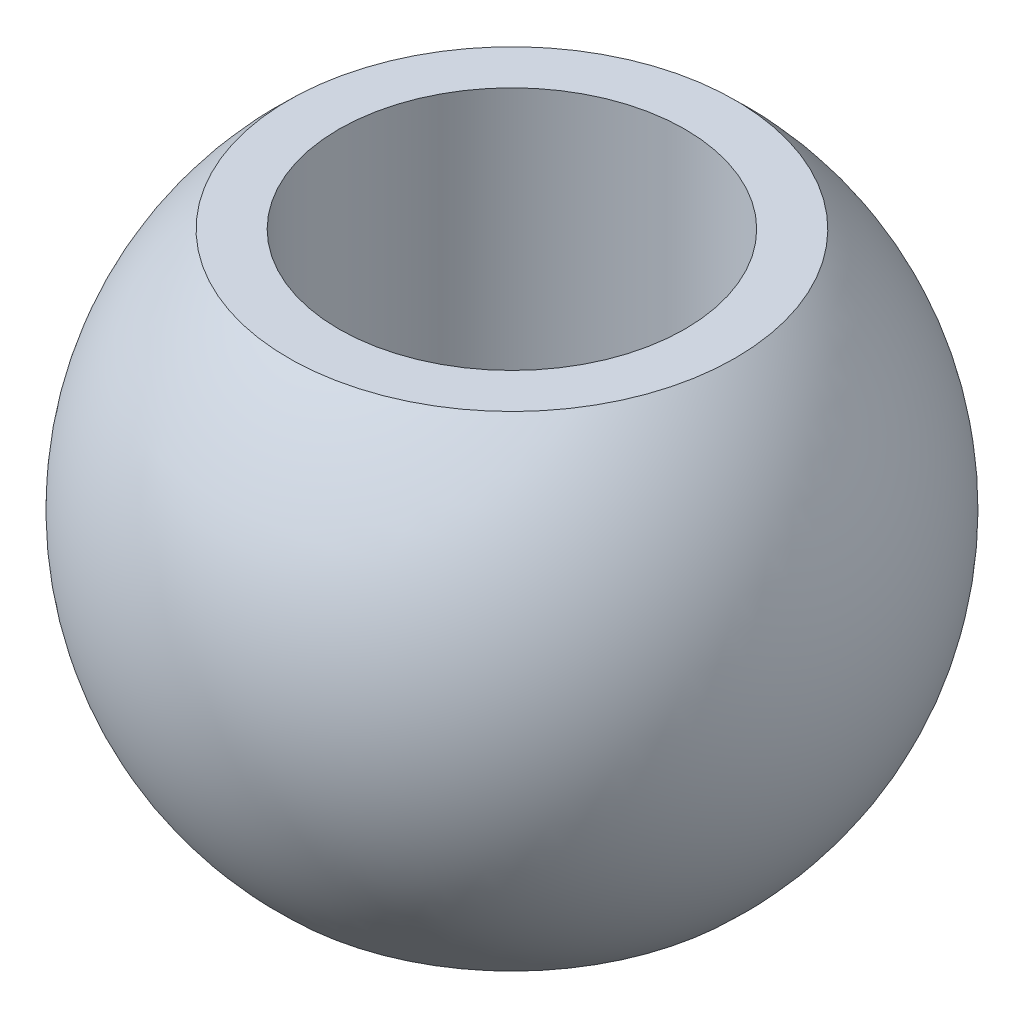
ISO-10303-21;
HEADER;
FILE_DESCRIPTION(('STEP AP214'),'2;1');
FILE_NAME('part.step','',(''),(''),'','','');
FILE_SCHEMA(('AUTOMOTIVE_DESIGN { 1 0 10303 214 1 1 1 1 }'));
ENDSEC;
DATA;
#1=APPLICATION_CONTEXT('core data for automotive mechanical design processes');
#2=APPLICATION_PROTOCOL_DEFINITION('international standard','automotive_design',2000,#1);
#3=PRODUCT_CONTEXT('',#1,'mechanical');
#4=PRODUCT('Part','Part','',(#3));
#5=PRODUCT_RELATED_PRODUCT_CATEGORY('part','',(#4));
#6=PRODUCT_DEFINITION_FORMATION('','',#4);
#7=PRODUCT_DEFINITION_CONTEXT('part definition',#1,'design');
#8=PRODUCT_DEFINITION('design','',#6,#7);
#9=PRODUCT_DEFINITION_SHAPE('','',#8);
#10=(LENGTH_UNIT() NAMED_UNIT(*) SI_UNIT(.MILLI.,.METRE.));
#11=(NAMED_UNIT(*) PLANE_ANGLE_UNIT() SI_UNIT($,.RADIAN.));
#12=(NAMED_UNIT(*) SI_UNIT($,.STERADIAN.) SOLID_ANGLE_UNIT());
#13=UNCERTAINTY_MEASURE_WITH_UNIT(LENGTH_MEASURE(1.E-05),#10,'distance_accuracy_value','');
#14=(GEOMETRIC_REPRESENTATION_CONTEXT(3) GLOBAL_UNCERTAINTY_ASSIGNED_CONTEXT((#13)) GLOBAL_UNIT_ASSIGNED_CONTEXT((#10,
#11,#12)) REPRESENTATION_CONTEXT('',''));
#15=CARTESIAN_POINT('',(0.,0.,0.));
#16=DIRECTION('',(0.,0.,1.));
#17=DIRECTION('',(1.,0.,0.));
#18=AXIS2_PLACEMENT_3D('',#15,#16,#17);
#19=CARTESIAN_POINT('',(5.,-7.,0.));
#20=DIRECTION('',(0.,-1.,0.));
#21=DIRECTION('',(0.,0.,-1.));
#22=AXIS2_PLACEMENT_3D('',#19,#20,#21);
#23=PLANE('',#22);
#24=CARTESIAN_POINT('',(0.,-7.,0.));
#25=DIRECTION('',(0.,-1.,0.));
#26=DIRECTION('',(0.,0.,-1.));
#27=AXIS2_PLACEMENT_3D('',#24,#25,#26);
#28=CIRCLE('',#27,6.45216242820963);
#29=CARTESIAN_POINT('',(6.45216242820963,-7.,0.));
#30=VERTEX_POINT('',#29);
#31=EDGE_CURVE('E10',#30,#30,#28,.T.);
#32=ORIENTED_EDGE('',*,*,#31,.T.);
#33=EDGE_LOOP('',(#32));
#34=FACE_BOUND('',#33,.T.);
#35=CARTESIAN_POINT('',(0.,-7.,0.));
#36=DIRECTION('',(0.,-1.,0.));
#37=DIRECTION('',(0.,0.,-1.));
#38=AXIS2_PLACEMENT_3D('',#35,#36,#37);
#39=CIRCLE('',#38,5.);
#40=CARTESIAN_POINT('',(0.,-7.,-5.));
#41=VERTEX_POINT('',#40);
#42=EDGE_CURVE('E45',#41,#41,#39,.T.);
#43=ORIENTED_EDGE('',*,*,#42,.F.);
#44=EDGE_LOOP('',(#43));
#45=FACE_BOUND('',#44,.T.);
#46=ADVANCED_FACE('F31',(#34,#45),#23,.T.);
#47=CARTESIAN_POINT('',(0.,0.,0.));
#48=DIRECTION('',(0.,-1.,0.));
#49=DIRECTION('',(1.,0.,0.));
#50=AXIS2_PLACEMENT_3D('',#47,#48,#49);
#51=SPHERICAL_SURFACE('',#50,9.52);
#52=CARTESIAN_POINT('',(0.,7.,0.));
#53=DIRECTION('',(0.,-1.,0.));
#54=DIRECTION('',(0.,0.,-1.));
#55=AXIS2_PLACEMENT_3D('',#52,#53,#54);
#56=CIRCLE('',#55,6.45216242820963);
#57=CARTESIAN_POINT('',(6.45216242820963,7.,0.));
#58=VERTEX_POINT('',#57);
#59=EDGE_CURVE('E37',#58,#58,#56,.T.);
#60=CARTESIAN_POINT('',(6.45216242820963,7.,0.));
#61=CARTESIAN_POINT('',(6.57263831351205,6.88895835952866,0.));
#62=CARTESIAN_POINT('',(6.69024186429578,6.77480103558679,0.));
#63=CARTESIAN_POINT('',(6.9194035674325,6.54057170507044,0.));
#64=CARTESIAN_POINT('',(7.03096171978549,6.42049969849596,0.));
#65=CARTESIAN_POINT('',(7.24773189666743,6.17475768702286,0.));
#66=CARTESIAN_POINT('',(7.35294392119637,6.04908768212425,0.));
#67=CARTESIAN_POINT('',(7.55674234396531,5.79248550197799,0.));
#68=CARTESIAN_POINT('',(7.65532874220531,5.66155332673034,0.));
#69=CARTESIAN_POINT('',(7.84561291573048,5.39477552679382,0.));
#70=CARTESIAN_POINT('',(7.93731069101564,5.25892990210494,0.));
#71=CARTESIAN_POINT('',(8.11357329146901,4.98268732276817,0.));
#72=CARTESIAN_POINT('',(8.1981381166372,4.84229036812027,0.));
#73=CARTESIAN_POINT('',(8.35990941735937,4.55731929728127,0.));
#74=CARTESIAN_POINT('',(8.43711589291333,4.41274518109016,0.));
#75=CARTESIAN_POINT('',(8.58396472861792,4.11980511031353,0.));
#76=CARTESIAN_POINT('',(8.65360708876854,3.97143915572801,0.));
#77=CARTESIAN_POINT('',(8.78514208177438,3.67131083147481,0.));
#78=CARTESIAN_POINT('',(8.8470347146296,3.51954846180712,0.));
#79=CARTESIAN_POINT('',(8.96290529730284,3.21303178438142,0.));
#80=CARTESIAN_POINT('',(9.01688324712085,3.05827747662342,0.));
#81=CARTESIAN_POINT('',(9.11678060174181,2.7461893736955,0.));
#82=CARTESIAN_POINT('',(9.16270000654474,2.58885557852558,0.));
#83=CARTESIAN_POINT('',(9.24635788688498,2.27202782640738,0.));
#84=CARTESIAN_POINT('',(9.28409636242228,2.11253386945911,0.));
#85=CARTESIAN_POINT('',(9.35129180374073,1.79181087664509,0.));
#86=CARTESIAN_POINT('',(9.38074876952189,1.63058184077935,0.));
#87=CARTESIAN_POINT('',(9.43130268270342,1.30681839732704,0.));
#88=CARTESIAN_POINT('',(9.4523996301038,1.14428398974046,0.));
#89=CARTESIAN_POINT('',(9.48617727899556,0.818342989114177,0.));
#90=CARTESIAN_POINT('',(9.49885798048695,0.654936396074465,0.));
#91=CARTESIAN_POINT('',(9.51576934098917,0.327686535356502,0.));
#92=CARTESIAN_POINT('',(9.52,0.163843267678251,0.));
#93=CARTESIAN_POINT('',(9.52,-0.163843267678249,0.));
#94=CARTESIAN_POINT('',(9.51576934098917,-0.3276865353565,0.));
#95=CARTESIAN_POINT('',(9.49885798048695,-0.654936396074462,0.));
#96=CARTESIAN_POINT('',(9.48617727899557,-0.818342989114175,0.));
#97=CARTESIAN_POINT('',(9.4523996301038,-1.14428398974046,0.));
#98=CARTESIAN_POINT('',(9.43130268270342,-1.30681839732703,0.));
#99=CARTESIAN_POINT('',(9.38074876952189,-1.63058184077935,0.));
#100=CARTESIAN_POINT('',(9.35129180374073,-1.79181087664509,0.));
#101=CARTESIAN_POINT('',(9.28409636242228,-2.1125338694591,0.));
#102=CARTESIAN_POINT('',(9.24635788688498,-2.27202782640738,0.));
#103=CARTESIAN_POINT('',(9.16270000654474,-2.58885557852558,0.));
#104=CARTESIAN_POINT('',(9.11678060174181,-2.7461893736955,0.));
#105=CARTESIAN_POINT('',(9.01688324712085,-3.05827747662342,0.));
#106=CARTESIAN_POINT('',(8.96290529730283,-3.21303178438142,0.));
#107=CARTESIAN_POINT('',(8.8470347146296,-3.51954846180711,0.));
#108=CARTESIAN_POINT('',(8.78514208177438,-3.6713108314748,0.));
#109=CARTESIAN_POINT('',(8.65360708876854,-3.97143915572801,0.));
#110=CARTESIAN_POINT('',(8.58396472861792,-4.11980511031353,0.));
#111=CARTESIAN_POINT('',(8.43711589291333,-4.41274518109015,0.));
#112=CARTESIAN_POINT('',(8.35990941735937,-4.55731929728126,0.));
#113=CARTESIAN_POINT('',(8.1981381166372,-4.84229036812027,0.));
#114=CARTESIAN_POINT('',(8.11357329146901,-4.98268732276817,0.));
#115=CARTESIAN_POINT('',(7.93731069101565,-5.25892990210494,0.));
#116=CARTESIAN_POINT('',(7.84561291573048,-5.39477552679382,0.));
#117=CARTESIAN_POINT('',(7.65532874220531,-5.66155332673034,0.));
#118=CARTESIAN_POINT('',(7.55674234396531,-5.79248550197798,0.));
#119=CARTESIAN_POINT('',(7.35294392119637,-6.04908768212424,0.));
#120=CARTESIAN_POINT('',(7.24773189666743,-6.17475768702286,0.));
#121=CARTESIAN_POINT('',(7.0309617197855,-6.42049969849596,0.));
#122=CARTESIAN_POINT('',(6.9194035674325,-6.54057170507043,0.));
#123=CARTESIAN_POINT('',(6.69024186429578,-6.77480103558679,0.));
#124=CARTESIAN_POINT('',(6.57263831351205,-6.88895835952866,0.));
#125=CARTESIAN_POINT('',(6.45216242820963,-7.,0.));
#126=B_SPLINE_CURVE_WITH_KNOTS('',3,(#60,#61,#62,#63,#64,#65,#66,#67,#68,#69,#70,#71,#72,#73,
#74,#75,#76,#77,#78,#79,#80,#81,#82,#83,#84,#85,#86,#87,#88,#89,#90,#91,#92,#93,#94,#95,#96,#97,
#98,#99,#100,#101,#102,#103,#104,#105,#106,#107,#108,#109,#110,#111,#112,#113,#114,#115,#116,
#117,#118,#119,#120,#121,#122,#123,#124,#125),.UNSPECIFIED.,.F.,.F.,(4,2,2,2,2,2,2,2,2,2,2,2,2,
2,2,2,2,2,2,2,2,2,2,2,2,2,2,2,2,2,2,2,4),(0.,0.491475227806413,0.982950455612823,
1.47442568341923,1.96590091122565,2.45737613903206,2.94885136683847,3.44032659464488,
3.93180182245129,4.4232770502577,4.91475227806412,5.40622750587053,5.89770273367694,
6.38917796148335,6.88065318928976,7.37212841709617,7.86360364490259,8.355078872709,
8.84655410051541,9.33802932832182,9.82950455612824,10.3209797839346,10.8124550117411,
11.3039302395475,11.7954054673539,12.2868806951603,12.7783559229667,13.2698311507731,
13.7613063785795,14.2527816063859,14.7442568341923,15.2357320619988,15.7272072898052),.UNSPECIFIED.);
#127=EDGE_CURVE('BSEAM55',#58,#30,#126,.T.);
#128=ORIENTED_EDGE('',*,*,#59,.T.);
#129=ORIENTED_EDGE('',*,*,#31,.F.);
#130=ORIENTED_EDGE('',*,*,#127,.T.);
#131=ORIENTED_EDGE('',*,*,#127,.F.);
#132=EDGE_LOOP('',(#128,#130,#129,#131));
#133=FACE_BOUND('',#132,.T.);
#134=ADVANCED_FACE('F55',(#133),#51,.T.);
#135=CARTESIAN_POINT('',(5.,7.,0.));
#136=DIRECTION('',(0.,1.,0.));
#137=DIRECTION('',(0.,0.,1.));
#138=AXIS2_PLACEMENT_3D('',#135,#136,#137);
#139=PLANE('',#138);
#140=CARTESIAN_POINT('',(0.,7.,0.));
#141=DIRECTION('',(0.,-1.,0.));
#142=DIRECTION('',(0.,0.,-1.));
#143=AXIS2_PLACEMENT_3D('',#140,#141,#142);
#144=CIRCLE('',#143,5.);
#145=CARTESIAN_POINT('',(0.,7.,-5.));
#146=VERTEX_POINT('',#145);
#147=EDGE_CURVE('E41',#146,#146,#144,.T.);
#148=ORIENTED_EDGE('',*,*,#147,.T.);
#149=EDGE_LOOP('',(#148));
#150=FACE_BOUND('',#149,.T.);
#151=ORIENTED_EDGE('',*,*,#59,.F.);
#152=EDGE_LOOP('',(#151));
#153=FACE_BOUND('',#152,.T.);
#154=ADVANCED_FACE('F59',(#150,#153),#139,.T.);
#155=CARTESIAN_POINT('',(0.,-11.1,0.));
#156=DIRECTION('',(0.,-1.,0.));
#157=DIRECTION('',(0.,0.,-1.));
#158=AXIS2_PLACEMENT_3D('',#155,#156,#157);
#159=CYLINDRICAL_SURFACE('',#158,5.);
#160=ORIENTED_EDGE('',*,*,#42,.T.);
#161=EDGE_LOOP('',(#160));
#162=FACE_BOUND('',#161,.T.);
#163=ORIENTED_EDGE('',*,*,#147,.F.);
#164=EDGE_LOOP('',(#163));
#165=FACE_BOUND('',#164,.T.);
#166=ADVANCED_FACE('F51',(#162,#165),#159,.F.);
#167=CLOSED_SHELL('',(#46,#134,#154,#166));
#168=MANIFOLD_SOLID_BREP('B2',#167);
#169=ADVANCED_BREP_SHAPE_REPRESENTATION('',(#18,#168),#14);
#170=SHAPE_DEFINITION_REPRESENTATION(#9,#169);
ENDSEC;
END-ISO-10303-21;
